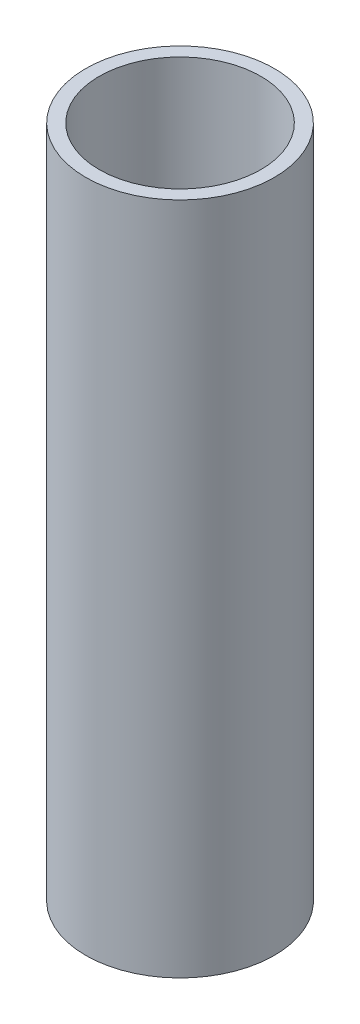
ISO-10303-21;
HEADER;
FILE_DESCRIPTION(('STEP AP214'),'2;1');
FILE_NAME('part.step','',(''),(''),'','','');
FILE_SCHEMA(('AUTOMOTIVE_DESIGN { 1 0 10303 214 1 1 1 1 }'));
ENDSEC;
DATA;
#1=APPLICATION_CONTEXT('core data for automotive mechanical design processes');
#2=APPLICATION_PROTOCOL_DEFINITION('international standard','automotive_design',2000,#1);
#3=PRODUCT_CONTEXT('',#1,'mechanical');
#4=PRODUCT('Part','Part','',(#3));
#5=PRODUCT_RELATED_PRODUCT_CATEGORY('part','',(#4));
#6=PRODUCT_DEFINITION_FORMATION('','',#4);
#7=PRODUCT_DEFINITION_CONTEXT('part definition',#1,'design');
#8=PRODUCT_DEFINITION('design','',#6,#7);
#9=PRODUCT_DEFINITION_SHAPE('','',#8);
#10=(LENGTH_UNIT() NAMED_UNIT(*) SI_UNIT(.MILLI.,.METRE.));
#11=(NAMED_UNIT(*) PLANE_ANGLE_UNIT() SI_UNIT($,.RADIAN.));
#12=(NAMED_UNIT(*) SI_UNIT($,.STERADIAN.) SOLID_ANGLE_UNIT());
#13=UNCERTAINTY_MEASURE_WITH_UNIT(LENGTH_MEASURE(1.E-05),#10,'distance_accuracy_value','');
#14=(GEOMETRIC_REPRESENTATION_CONTEXT(3) GLOBAL_UNCERTAINTY_ASSIGNED_CONTEXT((#13)) GLOBAL_UNIT_ASSIGNED_CONTEXT((#10,
#11,#12)) REPRESENTATION_CONTEXT('',''));
#15=CARTESIAN_POINT('',(0.,0.,0.));
#16=DIRECTION('',(0.,0.,1.));
#17=DIRECTION('',(1.,0.,0.));
#18=AXIS2_PLACEMENT_3D('',#15,#16,#17);
#19=CARTESIAN_POINT('',(0.,25.,0.));
#20=DIRECTION('',(0.,1.,0.));
#21=DIRECTION('',(0.,0.,1.));
#22=AXIS2_PLACEMENT_3D('',#19,#20,#21);
#23=PLANE('',#22);
#24=CARTESIAN_POINT('',(0.,25.,0.));
#25=DIRECTION('',(0.,1.,0.));
#26=DIRECTION('',(0.,0.,1.));
#27=AXIS2_PLACEMENT_3D('',#24,#25,#26);
#28=CIRCLE('',#27,3.5);
#29=CARTESIAN_POINT('',(0.,25.,3.5));
#30=VERTEX_POINT('',#29);
#31=EDGE_CURVE('E10',#30,#30,#28,.T.);
#32=ORIENTED_EDGE('',*,*,#31,.T.);
#33=EDGE_LOOP('',(#32));
#34=FACE_BOUND('',#33,.T.);
#35=CARTESIAN_POINT('',(0.,25.,0.));
#36=DIRECTION('',(0.,1.,0.));
#37=DIRECTION('',(0.,0.,1.));
#38=AXIS2_PLACEMENT_3D('',#35,#36,#37);
#39=CIRCLE('',#38,3.);
#40=CARTESIAN_POINT('',(0.,25.,3.));
#41=VERTEX_POINT('',#40);
#42=EDGE_CURVE('E46',#41,#41,#39,.T.);
#43=ORIENTED_EDGE('',*,*,#42,.F.);
#44=EDGE_LOOP('',(#43));
#45=FACE_BOUND('',#44,.T.);
#46=ADVANCED_FACE('F35',(#34,#45),#23,.T.);
#47=CARTESIAN_POINT('',(0.,0.,0.));
#48=DIRECTION('',(0.,1.,0.));
#49=DIRECTION('',(0.,0.,1.));
#50=AXIS2_PLACEMENT_3D('',#47,#48,#49);
#51=PLANE('',#50);
#52=CARTESIAN_POINT('',(0.,0.,0.));
#53=DIRECTION('',(0.,1.,0.));
#54=DIRECTION('',(0.,0.,1.));
#55=AXIS2_PLACEMENT_3D('',#52,#53,#54);
#56=CIRCLE('',#55,3.5);
#57=CARTESIAN_POINT('',(0.,0.,3.5));
#58=VERTEX_POINT('',#57);
#59=EDGE_CURVE('E39',#58,#58,#56,.T.);
#60=ORIENTED_EDGE('',*,*,#59,.F.);
#61=EDGE_LOOP('',(#60));
#62=FACE_BOUND('',#61,.T.);
#63=CARTESIAN_POINT('',(0.,0.,0.));
#64=DIRECTION('',(0.,1.,0.));
#65=DIRECTION('',(0.,0.,1.));
#66=AXIS2_PLACEMENT_3D('',#63,#64,#65);
#67=CIRCLE('',#66,3.);
#68=CARTESIAN_POINT('',(0.,0.,3.));
#69=VERTEX_POINT('',#68);
#70=EDGE_CURVE('E48',#69,#69,#67,.T.);
#71=ORIENTED_EDGE('',*,*,#70,.T.);
#72=EDGE_LOOP('',(#71));
#73=FACE_BOUND('',#72,.T.);
#74=ADVANCED_FACE('F58',(#62,#73),#51,.F.);
#75=CARTESIAN_POINT('',(0.,25.,0.));
#76=DIRECTION('',(0.,-1.,0.));
#77=DIRECTION('',(0.,0.,-1.));
#78=AXIS2_PLACEMENT_3D('',#75,#76,#77);
#79=CYLINDRICAL_SURFACE('',#78,3.5);
#80=ORIENTED_EDGE('',*,*,#31,.F.);
#81=EDGE_LOOP('',(#80));
#82=FACE_BOUND('',#81,.T.);
#83=ORIENTED_EDGE('',*,*,#59,.T.);
#84=EDGE_LOOP('',(#83));
#85=FACE_BOUND('',#84,.T.);
#86=ADVANCED_FACE('F37',(#82,#85),#79,.T.);
#87=CARTESIAN_POINT('',(0.,25.,0.));
#88=DIRECTION('',(0.,-1.,0.));
#89=DIRECTION('',(0.,0.,-1.));
#90=AXIS2_PLACEMENT_3D('',#87,#88,#89);
#91=CYLINDRICAL_SURFACE('',#90,3.);
#92=ORIENTED_EDGE('',*,*,#42,.T.);
#93=EDGE_LOOP('',(#92));
#94=FACE_BOUND('',#93,.T.);
#95=ORIENTED_EDGE('',*,*,#70,.F.);
#96=EDGE_LOOP('',(#95));
#97=FACE_BOUND('',#96,.T.);
#98=ADVANCED_FACE('F54',(#94,#97),#91,.F.);
#99=CLOSED_SHELL('',(#46,#74,#86,#98));
#100=MANIFOLD_SOLID_BREP('B2',#99);
#101=ADVANCED_BREP_SHAPE_REPRESENTATION('',(#18,#100),#14);
#102=SHAPE_DEFINITION_REPRESENTATION(#9,#101);
ENDSEC;
END-ISO-10303-21;
